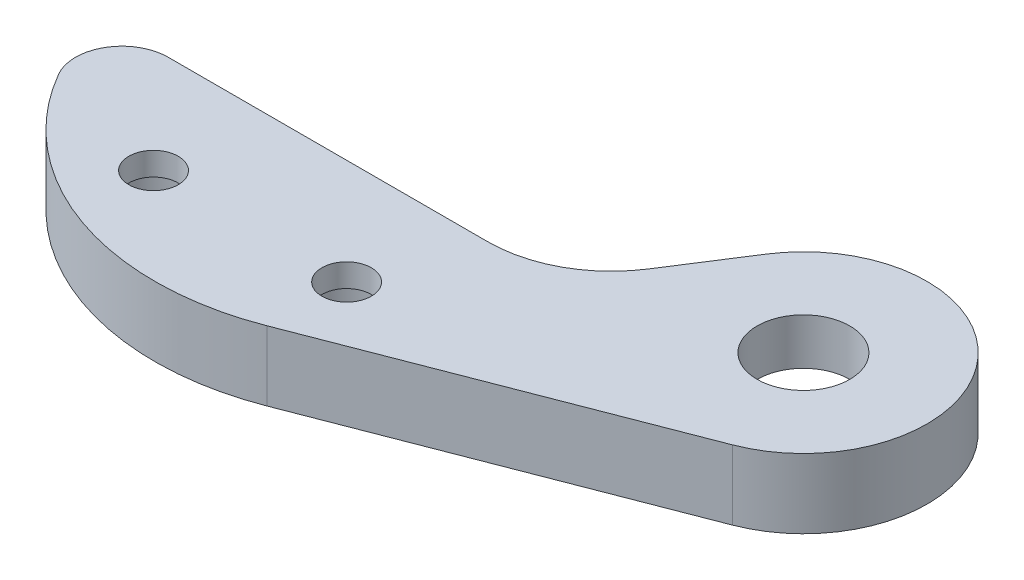
ISO-10303-21;
HEADER;
FILE_DESCRIPTION(('STEP AP214'),'2;1');
FILE_NAME('part.step','',(''),(''),'','','');
FILE_SCHEMA(('AUTOMOTIVE_DESIGN { 1 0 10303 214 1 1 1 1 }'));
ENDSEC;
DATA;
#1=APPLICATION_CONTEXT('core data for automotive mechanical design processes');
#2=APPLICATION_PROTOCOL_DEFINITION('international standard','automotive_design',2000,#1);
#3=PRODUCT_CONTEXT('',#1,'mechanical');
#4=PRODUCT('Part','Part','',(#3));
#5=PRODUCT_RELATED_PRODUCT_CATEGORY('part','',(#4));
#6=PRODUCT_DEFINITION_FORMATION('','',#4);
#7=PRODUCT_DEFINITION_CONTEXT('part definition',#1,'design');
#8=PRODUCT_DEFINITION('design','',#6,#7);
#9=PRODUCT_DEFINITION_SHAPE('','',#8);
#10=(LENGTH_UNIT() NAMED_UNIT(*) SI_UNIT(.MILLI.,.METRE.));
#11=(NAMED_UNIT(*) PLANE_ANGLE_UNIT() SI_UNIT($,.RADIAN.));
#12=(NAMED_UNIT(*) SI_UNIT($,.STERADIAN.) SOLID_ANGLE_UNIT());
#13=UNCERTAINTY_MEASURE_WITH_UNIT(LENGTH_MEASURE(1.E-05),#10,'distance_accuracy_value','');
#14=(GEOMETRIC_REPRESENTATION_CONTEXT(3) GLOBAL_UNCERTAINTY_ASSIGNED_CONTEXT((#13)) GLOBAL_UNIT_ASSIGNED_CONTEXT((#10,
#11,#12)) REPRESENTATION_CONTEXT('',''));
#15=CARTESIAN_POINT('',(0.,0.,0.));
#16=DIRECTION('',(0.,0.,1.));
#17=DIRECTION('',(1.,0.,0.));
#18=AXIS2_PLACEMENT_3D('',#15,#16,#17);
#19=CARTESIAN_POINT('',(0.,-4.5,0.));
#20=DIRECTION('',(0.,1.,0.));
#21=DIRECTION('',(0.,0.,-1.));
#22=AXIS2_PLACEMENT_3D('',#19,#20,#21);
#23=CYLINDRICAL_SURFACE('',#22,17.);
#24=CARTESIAN_POINT('',(0.,0.,0.));
#25=DIRECTION('',(0.,-1.,0.));
#26=DIRECTION('',(0.,0.,-1.));
#27=AXIS2_PLACEMENT_3D('',#24,#25,#26);
#28=CIRCLE('',#27,17.);
#29=CARTESIAN_POINT('',(6.12,0.,15.8601891539792));
#30=VERTEX_POINT('',#29);
#31=CARTESIAN_POINT('',(-14.7224318643355,0.,8.5));
#32=VERTEX_POINT('',#31);
#33=EDGE_CURVE('E116',#30,#32,#28,.T.);
#34=ORIENTED_EDGE('',*,*,#33,.T.);
#35=DIRECTION('',(0.,1.,0.));
#36=VECTOR('',#35,1.);
#37=CARTESIAN_POINT('',(-14.7224318643355,-4.5,8.5));
#38=LINE('',#37,#36);
#39=CARTESIAN_POINT('',(-14.7224318643355,-4.5,8.5));
#40=VERTEX_POINT('',#39);
#41=EDGE_CURVE('E98',#40,#32,#38,.T.);
#42=ORIENTED_EDGE('',*,*,#41,.F.);
#43=CARTESIAN_POINT('',(0.,-4.5,0.));
#44=DIRECTION('',(0.,-1.,0.));
#45=DIRECTION('',(0.,0.,-1.));
#46=AXIS2_PLACEMENT_3D('',#43,#44,#45);
#47=CIRCLE('',#46,17.);
#48=CARTESIAN_POINT('',(6.12,-4.5,15.8601891539792));
#49=VERTEX_POINT('',#48);
#50=EDGE_CURVE('E104',#49,#40,#47,.T.);
#51=ORIENTED_EDGE('',*,*,#50,.F.);
#52=DIRECTION('',(0.,1.,0.));
#53=VECTOR('',#52,1.);
#54=CARTESIAN_POINT('',(6.12,-4.5,15.8601891539792));
#55=LINE('',#54,#53);
#56=EDGE_CURVE('E127',#49,#30,#55,.T.);
#57=ORIENTED_EDGE('',*,*,#56,.T.);
#58=EDGE_LOOP('',(#34,#42,#51,#57));
#59=FACE_BOUND('',#58,.T.);
#60=ADVANCED_FACE('F38',(#59),#23,.T.);
#61=CARTESIAN_POINT('',(27.88,-4.5,7.46361842540199));
#62=DIRECTION('',(0.359999999999999,0.,0.932952303175248));
#63=DIRECTION('',(0.932952303175248,0.,-0.359999999999999));
#64=AXIS2_PLACEMENT_3D('',#61,#62,#63);
#65=PLANE('',#64);
#66=DIRECTION('',(-0.932952303175248,0.,0.359999999999999));
#67=VECTOR('',#66,1.);
#68=CARTESIAN_POINT('',(27.88,0.,7.46361842540199));
#69=LINE('',#68,#67);
#70=CARTESIAN_POINT('',(27.88,0.,7.46361842540199));
#71=VERTEX_POINT('',#70);
#72=EDGE_CURVE('E113',#71,#30,#69,.T.);
#73=ORIENTED_EDGE('',*,*,#72,.T.);
#74=ORIENTED_EDGE('',*,*,#56,.F.);
#75=DIRECTION('',(-0.932952303175248,0.,0.359999999999999));
#76=VECTOR('',#75,1.);
#77=CARTESIAN_POINT('',(27.88,-4.5,7.46361842540199));
#78=LINE('',#77,#76);
#79=CARTESIAN_POINT('',(27.88,-4.5,7.46361842540199));
#80=VERTEX_POINT('',#79);
#81=EDGE_CURVE('E109',#80,#49,#78,.T.);
#82=ORIENTED_EDGE('',*,*,#81,.F.);
#83=DIRECTION('',(0.,1.,0.));
#84=VECTOR('',#83,1.);
#85=CARTESIAN_POINT('',(27.88,-4.5,7.46361842540199));
#86=LINE('',#85,#84);
#87=EDGE_CURVE('E154',#80,#71,#86,.T.);
#88=ORIENTED_EDGE('',*,*,#87,.T.);
#89=EDGE_LOOP('',(#73,#74,#82,#88));
#90=FACE_BOUND('',#89,.T.);
#91=ADVANCED_FACE('F164',(#90),#65,.T.);
#92=CARTESIAN_POINT('',(25.,-4.5,0.));
#93=DIRECTION('',(0.,1.,0.));
#94=DIRECTION('',(0.,0.,-1.));
#95=AXIS2_PLACEMENT_3D('',#92,#93,#94);
#96=CYLINDRICAL_SURFACE('',#95,8.00000000000001);
#97=CARTESIAN_POINT('',(25.,0.,0.));
#98=DIRECTION('',(0.,-1.,0.));
#99=DIRECTION('',(0.,0.,-1.));
#100=AXIS2_PLACEMENT_3D('',#97,#98,#99);
#101=CIRCLE('',#100,8.00000000000001);
#102=CARTESIAN_POINT('',(18.2638318794235,0.,-4.31555779144817));
#103=VERTEX_POINT('',#102);
#104=EDGE_CURVE('E150',#103,#71,#101,.T.);
#105=ORIENTED_EDGE('',*,*,#104,.T.);
#106=ORIENTED_EDGE('',*,*,#87,.F.);
#107=CARTESIAN_POINT('',(25.,-4.5,0.));
#108=DIRECTION('',(0.,-1.,0.));
#109=DIRECTION('',(0.,0.,-1.));
#110=AXIS2_PLACEMENT_3D('',#107,#108,#109);
#111=CIRCLE('',#110,8.00000000000001);
#112=CARTESIAN_POINT('',(18.2638318794235,-4.5,-4.31555779144817));
#113=VERTEX_POINT('',#112);
#114=EDGE_CURVE('E120',#113,#80,#111,.T.);
#115=ORIENTED_EDGE('',*,*,#114,.F.);
#116=DIRECTION('',(0.,1.,0.));
#117=VECTOR('',#116,1.);
#118=CARTESIAN_POINT('',(18.2638318794235,-4.5,-4.31555779144817));
#119=LINE('',#118,#117);
#120=EDGE_CURVE('E118',#113,#103,#119,.T.);
#121=ORIENTED_EDGE('',*,*,#120,.T.);
#122=EDGE_LOOP('',(#105,#106,#115,#121));
#123=FACE_BOUND('',#122,.T.);
#124=ADVANCED_FACE('F158',(#123),#96,.T.);
#125=CARTESIAN_POINT('',(12.9364306663359,-4.5,4.));
#126=DIRECTION('',(-0.842021015072063,0.,-0.539444723931019));
#127=DIRECTION('',(-0.539444723931019,0.,0.842021015072063));
#128=AXIS2_PLACEMENT_3D('',#125,#126,#127);
#129=PLANE('',#128);
#130=DIRECTION('',(0.539444723931019,0.,-0.842021015072062));
#131=VECTOR('',#130,1.);
#132=CARTESIAN_POINT('',(12.9364306663359,0.,4.));
#133=LINE('',#132,#131);
#134=CARTESIAN_POINT('',(15.2968858978029,0.,0.315557791448156));
#135=VERTEX_POINT('',#134);
#136=EDGE_CURVE('E148',#135,#103,#133,.T.);
#137=ORIENTED_EDGE('',*,*,#136,.T.);
#138=ORIENTED_EDGE('',*,*,#120,.F.);
#139=DIRECTION('',(0.539444723931019,0.,-0.842021015072062));
#140=VECTOR('',#139,1.);
#141=CARTESIAN_POINT('',(12.9364306663359,-4.5,4.));
#142=LINE('',#141,#140);
#143=CARTESIAN_POINT('',(15.2968858978029,-4.5,0.315557791448156));
#144=VERTEX_POINT('',#143);
#145=EDGE_CURVE('E133',#144,#113,#142,.T.);
#146=ORIENTED_EDGE('',*,*,#145,.F.);
#147=DIRECTION('',(0.,1.,0.));
#148=VECTOR('',#147,1.);
#149=CARTESIAN_POINT('',(15.2968858978029,-4.5,0.315557791448155));
#150=LINE('',#149,#148);
#151=EDGE_CURVE('E126',#135,#144,#150,.F.);
#152=ORIENTED_EDGE('',*,*,#151,.F.);
#153=EDGE_LOOP('',(#137,#138,#146,#152));
#154=FACE_BOUND('',#153,.T.);
#155=ADVANCED_FACE('F134',(#154),#129,.T.);
#156=CARTESIAN_POINT('',(-12.1243556529821,-4.5,4.));
#157=DIRECTION('',(0.,0.,-1.));
#158=DIRECTION('',(-1.,0.,0.));
#159=AXIS2_PLACEMENT_3D('',#156,#157,#158);
#160=PLANE('',#159);
#161=DIRECTION('',(1.,0.,0.));
#162=VECTOR('',#161,1.);
#163=CARTESIAN_POINT('',(-12.1243556529821,-4.5,4.));
#164=LINE('',#163,#162);
#165=CARTESIAN_POINT('',(-12.1243556529821,-4.5,4.));
#166=VERTEX_POINT('',#165);
#167=CARTESIAN_POINT('',(8.56071777722641,-4.5,4.));
#168=VERTEX_POINT('',#167);
#169=EDGE_CURVE('E103',#166,#168,#164,.T.);
#170=ORIENTED_EDGE('',*,*,#169,.F.);
#171=DIRECTION('',(0.,1.,0.));
#172=VECTOR('',#171,1.);
#173=CARTESIAN_POINT('',(-12.1243556529821,-4.5,4.));
#174=LINE('',#173,#172);
#175=CARTESIAN_POINT('',(-12.1243556529821,0.,4.));
#176=VERTEX_POINT('',#175);
#177=EDGE_CURVE('E101',#166,#176,#174,.T.);
#178=ORIENTED_EDGE('',*,*,#177,.T.);
#179=DIRECTION('',(1.,0.,0.));
#180=VECTOR('',#179,1.);
#181=CARTESIAN_POINT('',(-12.1243556529821,0.,4.));
#182=LINE('',#181,#180);
#183=CARTESIAN_POINT('',(8.56071777722641,0.,4.));
#184=VERTEX_POINT('',#183);
#185=EDGE_CURVE('E145',#176,#184,#182,.T.);
#186=ORIENTED_EDGE('',*,*,#185,.T.);
#187=DIRECTION('',(0.,1.,0.));
#188=VECTOR('',#187,1.);
#189=CARTESIAN_POINT('',(8.56071777722641,0.,4.));
#190=LINE('',#189,#188);
#191=EDGE_CURVE('E124',#168,#184,#190,.T.);
#192=ORIENTED_EDGE('',*,*,#191,.F.);
#193=EDGE_LOOP('',(#170,#178,#186,#192));
#194=FACE_BOUND('',#193,.T.);
#195=ADVANCED_FACE('F177',(#194),#160,.T.);
#196=CARTESIAN_POINT('',(-12.1243556529821,-4.5,7.));
#197=DIRECTION('',(0.,1.,0.));
#198=DIRECTION('',(0.,0.,-1.));
#199=AXIS2_PLACEMENT_3D('',#196,#197,#198);
#200=CYLINDRICAL_SURFACE('',#199,3.);
#201=CARTESIAN_POINT('',(-12.1243556529821,0.,7.));
#202=DIRECTION('',(0.,-1.,0.));
#203=DIRECTION('',(0.,0.,-1.));
#204=AXIS2_PLACEMENT_3D('',#201,#202,#203);
#205=CIRCLE('',#204,3.);
#206=EDGE_CURVE('E142',#32,#176,#205,.T.);
#207=ORIENTED_EDGE('',*,*,#206,.T.);
#208=ORIENTED_EDGE('',*,*,#177,.F.);
#209=CARTESIAN_POINT('',(-12.1243556529821,-4.5,7.));
#210=DIRECTION('',(0.,-1.,0.));
#211=DIRECTION('',(0.,0.,-1.));
#212=AXIS2_PLACEMENT_3D('',#209,#210,#211);
#213=CIRCLE('',#212,3.);
#214=EDGE_CURVE('E94',#40,#166,#213,.T.);
#215=ORIENTED_EDGE('',*,*,#214,.F.);
#216=ORIENTED_EDGE('',*,*,#41,.T.);
#217=EDGE_LOOP('',(#207,#208,#215,#216));
#218=FACE_BOUND('',#217,.T.);
#219=ADVANCED_FACE('F96',(#218),#200,.T.);
#220=CARTESIAN_POINT('',(0.,-4.5,0.));
#221=DIRECTION('',(0.,1.,0.));
#222=DIRECTION('',(0.,0.,-1.));
#223=AXIS2_PLACEMENT_3D('',#220,#221,#222);
#224=PLANE('',#223);
#225=CARTESIAN_POINT('',(25.,-4.5,0.));
#226=DIRECTION('',(0.,1.,0.));
#227=DIRECTION('',(0.,0.,1.));
#228=AXIS2_PLACEMENT_3D('',#225,#226,#227);
#229=CIRCLE('',#228,5.25000000000001);
#230=CARTESIAN_POINT('',(25.,-4.5,5.25000000000001));
#231=VERTEX_POINT('',#230);
#232=EDGE_CURVE('E236',#231,#231,#229,.T.);
#233=ORIENTED_EDGE('',*,*,#232,.T.);
#234=EDGE_LOOP('',(#233));
#235=FACE_BOUND('',#234,.T.);
#236=CARTESIAN_POINT('',(-6.25,-4.5,10.8253175473055));
#237=DIRECTION('',(0.,1.,0.));
#238=DIRECTION('',(0.,0.,1.));
#239=AXIS2_PLACEMENT_3D('',#236,#237,#238);
#240=CIRCLE('',#239,3.025);
#241=CARTESIAN_POINT('',(-6.25,-4.5,13.8503175473055));
#242=VERTEX_POINT('',#241);
#243=EDGE_CURVE('E246',#242,#242,#240,.T.);
#244=ORIENTED_EDGE('',*,*,#243,.T.);
#245=EDGE_LOOP('',(#244));
#246=FACE_BOUND('',#245,.T.);
#247=CARTESIAN_POINT('',(6.25,-4.5,10.8253175473055));
#248=DIRECTION('',(0.,1.,0.));
#249=DIRECTION('',(0.,0.,1.));
#250=AXIS2_PLACEMENT_3D('',#247,#248,#249);
#251=CIRCLE('',#250,3.025);
#252=CARTESIAN_POINT('',(6.25,-4.5,13.8503175473055));
#253=VERTEX_POINT('',#252);
#254=EDGE_CURVE('E258',#253,#253,#251,.T.);
#255=ORIENTED_EDGE('',*,*,#254,.T.);
#256=EDGE_LOOP('',(#255));
#257=FACE_BOUND('',#256,.T.);
#258=ORIENTED_EDGE('',*,*,#50,.T.);
#259=ORIENTED_EDGE('',*,*,#214,.T.);
#260=ORIENTED_EDGE('',*,*,#169,.T.);
#261=CARTESIAN_POINT('',(8.56071777722641,-4.5,-4.));
#262=DIRECTION('',(0.,-1.,0.));
#263=DIRECTION('',(0.,0.,-1.));
#264=AXIS2_PLACEMENT_3D('',#261,#262,#263);
#265=CIRCLE('',#264,8.);
#266=EDGE_CURVE('E11',#144,#168,#265,.T.);
#267=ORIENTED_EDGE('',*,*,#266,.F.);
#268=ORIENTED_EDGE('',*,*,#145,.T.);
#269=ORIENTED_EDGE('',*,*,#114,.T.);
#270=ORIENTED_EDGE('',*,*,#81,.T.);
#271=EDGE_LOOP('',(#258,#259,#260,#267,#268,#269,#270));
#272=FACE_BOUND('',#271,.T.);
#273=ADVANCED_FACE('F107',(#235,#246,#257,#272),#224,.F.);
#274=CARTESIAN_POINT('',(0.,0.,0.));
#275=DIRECTION('',(0.,1.,0.));
#276=DIRECTION('',(0.,0.,-1.));
#277=AXIS2_PLACEMENT_3D('',#274,#275,#276);
#278=PLANE('',#277);
#279=CARTESIAN_POINT('',(25.,0.,0.));
#280=DIRECTION('',(0.,1.,0.));
#281=DIRECTION('',(0.,0.,1.));
#282=AXIS2_PLACEMENT_3D('',#279,#280,#281);
#283=CIRCLE('',#282,3.00000000000001);
#284=CARTESIAN_POINT('',(25.,0.,3.00000000000001));
#285=VERTEX_POINT('',#284);
#286=EDGE_CURVE('E243',#285,#285,#283,.T.);
#287=ORIENTED_EDGE('',*,*,#286,.F.);
#288=EDGE_LOOP('',(#287));
#289=FACE_BOUND('',#288,.T.);
#290=CARTESIAN_POINT('',(-6.25,0.,10.8253175473055));
#291=DIRECTION('',(0.,1.,0.));
#292=DIRECTION('',(0.,0.,1.));
#293=AXIS2_PLACEMENT_3D('',#290,#291,#292);
#294=CIRCLE('',#293,1.60000000000001);
#295=CARTESIAN_POINT('',(-6.25,0.,12.4253175473055));
#296=VERTEX_POINT('',#295);
#297=EDGE_CURVE('E255',#296,#296,#294,.T.);
#298=ORIENTED_EDGE('',*,*,#297,.F.);
#299=EDGE_LOOP('',(#298));
#300=FACE_BOUND('',#299,.T.);
#301=CARTESIAN_POINT('',(6.25,0.,10.8253175473055));
#302=DIRECTION('',(0.,1.,0.));
#303=DIRECTION('',(0.,0.,1.));
#304=AXIS2_PLACEMENT_3D('',#301,#302,#303);
#305=CIRCLE('',#304,1.60000000000001);
#306=CARTESIAN_POINT('',(6.25,0.,12.4253175473055));
#307=VERTEX_POINT('',#306);
#308=EDGE_CURVE('E143',#307,#307,#305,.T.);
#309=ORIENTED_EDGE('',*,*,#308,.F.);
#310=EDGE_LOOP('',(#309));
#311=FACE_BOUND('',#310,.T.);
#312=ORIENTED_EDGE('',*,*,#33,.F.);
#313=ORIENTED_EDGE('',*,*,#72,.F.);
#314=ORIENTED_EDGE('',*,*,#104,.F.);
#315=ORIENTED_EDGE('',*,*,#136,.F.);
#316=CARTESIAN_POINT('',(8.56071777722641,0.,-4.));
#317=DIRECTION('',(0.,-1.,0.));
#318=DIRECTION('',(0.,0.,-1.));
#319=AXIS2_PLACEMENT_3D('',#316,#317,#318);
#320=CIRCLE('',#319,8.);
#321=EDGE_CURVE('E46',#184,#135,#320,.F.);
#322=ORIENTED_EDGE('',*,*,#321,.F.);
#323=ORIENTED_EDGE('',*,*,#185,.F.);
#324=ORIENTED_EDGE('',*,*,#206,.F.);
#325=EDGE_LOOP('',(#312,#313,#314,#315,#322,#323,#324));
#326=FACE_BOUND('',#325,.T.);
#327=ADVANCED_FACE('F162',(#289,#300,#311,#326),#278,.T.);
#328=CARTESIAN_POINT('',(6.25,-4.5,10.8253175473055));
#329=DIRECTION('',(0.,-1.,0.));
#330=DIRECTION('',(0.,0.,1.));
#331=AXIS2_PLACEMENT_3D('',#328,#329,#330);
#332=CYLINDRICAL_SURFACE('',#331,1.60000000000001);
#333=ORIENTED_EDGE('',*,*,#308,.T.);
#334=EDGE_LOOP('',(#333));
#335=FACE_BOUND('',#334,.T.);
#336=CARTESIAN_POINT('',(6.25,-1.5,10.8253175473055));
#337=DIRECTION('',(0.,1.,0.));
#338=DIRECTION('',(0.,0.,1.));
#339=AXIS2_PLACEMENT_3D('',#336,#337,#338);
#340=CIRCLE('',#339,1.60000000000001);
#341=CARTESIAN_POINT('',(6.25,-1.5,12.4253175473055));
#342=VERTEX_POINT('',#341);
#343=EDGE_CURVE('E264',#342,#342,#340,.T.);
#344=ORIENTED_EDGE('',*,*,#343,.F.);
#345=EDGE_LOOP('',(#344));
#346=FACE_BOUND('',#345,.T.);
#347=ADVANCED_FACE('F189',(#335,#346),#332,.F.);
#348=CARTESIAN_POINT('',(7.85000000000001,-1.5,10.8253175473055));
#349=DIRECTION('',(0.,1.,0.));
#350=DIRECTION('',(0.,0.,-1.));
#351=AXIS2_PLACEMENT_3D('',#348,#349,#350);
#352=PLANE('',#351);
#353=ORIENTED_EDGE('',*,*,#343,.T.);
#354=EDGE_LOOP('',(#353));
#355=FACE_BOUND('',#354,.T.);
#356=CARTESIAN_POINT('',(6.25,-1.5,10.8253175473055));
#357=DIRECTION('',(0.,1.,0.));
#358=DIRECTION('',(0.,0.,1.));
#359=AXIS2_PLACEMENT_3D('',#356,#357,#358);
#360=CIRCLE('',#359,3.025);
#361=CARTESIAN_POINT('',(6.25,-1.5,13.8503175473055));
#362=VERTEX_POINT('',#361);
#363=EDGE_CURVE('E261',#362,#362,#360,.T.);
#364=ORIENTED_EDGE('',*,*,#363,.F.);
#365=EDGE_LOOP('',(#364));
#366=FACE_BOUND('',#365,.T.);
#367=ADVANCED_FACE('F196',(#355,#366),#352,.F.);
#368=CARTESIAN_POINT('',(6.25,-4.5,10.8253175473055));
#369=DIRECTION('',(0.,-1.,0.));
#370=DIRECTION('',(0.,0.,1.));
#371=AXIS2_PLACEMENT_3D('',#368,#369,#370);
#372=CYLINDRICAL_SURFACE('',#371,3.025);
#373=ORIENTED_EDGE('',*,*,#363,.T.);
#374=EDGE_LOOP('',(#373));
#375=FACE_BOUND('',#374,.T.);
#376=ORIENTED_EDGE('',*,*,#254,.F.);
#377=EDGE_LOOP('',(#376));
#378=FACE_BOUND('',#377,.T.);
#379=ADVANCED_FACE('F200',(#375,#378),#372,.F.);
#380=CARTESIAN_POINT('',(-6.25,-4.5,10.8253175473055));
#381=DIRECTION('',(0.,-1.,0.));
#382=DIRECTION('',(0.,0.,1.));
#383=AXIS2_PLACEMENT_3D('',#380,#381,#382);
#384=CYLINDRICAL_SURFACE('',#383,1.60000000000001);
#385=ORIENTED_EDGE('',*,*,#297,.T.);
#386=EDGE_LOOP('',(#385));
#387=FACE_BOUND('',#386,.T.);
#388=CARTESIAN_POINT('',(-6.25,-1.5,10.8253175473055));
#389=DIRECTION('',(0.,1.,0.));
#390=DIRECTION('',(0.,0.,1.));
#391=AXIS2_PLACEMENT_3D('',#388,#389,#390);
#392=CIRCLE('',#391,1.60000000000001);
#393=CARTESIAN_POINT('',(-6.25,-1.5,12.4253175473055));
#394=VERTEX_POINT('',#393);
#395=EDGE_CURVE('E252',#394,#394,#392,.T.);
#396=ORIENTED_EDGE('',*,*,#395,.F.);
#397=EDGE_LOOP('',(#396));
#398=FACE_BOUND('',#397,.T.);
#399=ADVANCED_FACE('F204',(#387,#398),#384,.F.);
#400=CARTESIAN_POINT('',(-4.64999999999999,-1.5,10.8253175473055));
#401=DIRECTION('',(0.,1.,0.));
#402=DIRECTION('',(0.,0.,-1.));
#403=AXIS2_PLACEMENT_3D('',#400,#401,#402);
#404=PLANE('',#403);
#405=ORIENTED_EDGE('',*,*,#395,.T.);
#406=EDGE_LOOP('',(#405));
#407=FACE_BOUND('',#406,.T.);
#408=CARTESIAN_POINT('',(-6.25,-1.5,10.8253175473055));
#409=DIRECTION('',(0.,1.,0.));
#410=DIRECTION('',(0.,0.,1.));
#411=AXIS2_PLACEMENT_3D('',#408,#409,#410);
#412=CIRCLE('',#411,3.025);
#413=CARTESIAN_POINT('',(-6.25,-1.5,13.8503175473055));
#414=VERTEX_POINT('',#413);
#415=EDGE_CURVE('E249',#414,#414,#412,.T.);
#416=ORIENTED_EDGE('',*,*,#415,.F.);
#417=EDGE_LOOP('',(#416));
#418=FACE_BOUND('',#417,.T.);
#419=ADVANCED_FACE('F208',(#407,#418),#404,.F.);
#420=CARTESIAN_POINT('',(-6.25,-4.5,10.8253175473055));
#421=DIRECTION('',(0.,-1.,0.));
#422=DIRECTION('',(0.,0.,1.));
#423=AXIS2_PLACEMENT_3D('',#420,#421,#422);
#424=CYLINDRICAL_SURFACE('',#423,3.025);
#425=ORIENTED_EDGE('',*,*,#415,.T.);
#426=EDGE_LOOP('',(#425));
#427=FACE_BOUND('',#426,.T.);
#428=ORIENTED_EDGE('',*,*,#243,.F.);
#429=EDGE_LOOP('',(#428));
#430=FACE_BOUND('',#429,.T.);
#431=ADVANCED_FACE('F212',(#427,#430),#424,.F.);
#432=CARTESIAN_POINT('',(25.,-4.5,0.));
#433=DIRECTION('',(0.,-1.,0.));
#434=DIRECTION('',(0.,0.,1.));
#435=AXIS2_PLACEMENT_3D('',#432,#433,#434);
#436=CYLINDRICAL_SURFACE('',#435,3.00000000000001);
#437=ORIENTED_EDGE('',*,*,#286,.T.);
#438=EDGE_LOOP('',(#437));
#439=FACE_BOUND('',#438,.T.);
#440=CARTESIAN_POINT('',(25.,-3.,0.));
#441=DIRECTION('',(0.,1.,0.));
#442=DIRECTION('',(0.,0.,1.));
#443=AXIS2_PLACEMENT_3D('',#440,#441,#442);
#444=CIRCLE('',#443,3.00000000000001);
#445=CARTESIAN_POINT('',(25.,-3.,3.00000000000001));
#446=VERTEX_POINT('',#445);
#447=EDGE_CURVE('E238',#446,#446,#444,.T.);
#448=ORIENTED_EDGE('',*,*,#447,.F.);
#449=EDGE_LOOP('',(#448));
#450=FACE_BOUND('',#449,.T.);
#451=ADVANCED_FACE('F216',(#439,#450),#436,.F.);
#452=CARTESIAN_POINT('',(28.,-3.,0.));
#453=DIRECTION('',(0.,1.,0.));
#454=DIRECTION('',(0.,0.,-1.));
#455=AXIS2_PLACEMENT_3D('',#452,#453,#454);
#456=PLANE('',#455);
#457=ORIENTED_EDGE('',*,*,#447,.T.);
#458=EDGE_LOOP('',(#457));
#459=FACE_BOUND('',#458,.T.);
#460=CARTESIAN_POINT('',(25.,-3.,0.));
#461=DIRECTION('',(0.,1.,0.));
#462=DIRECTION('',(0.,0.,1.));
#463=AXIS2_PLACEMENT_3D('',#460,#461,#462);
#464=CIRCLE('',#463,5.25000000000001);
#465=CARTESIAN_POINT('',(25.,-3.,5.25000000000001));
#466=VERTEX_POINT('',#465);
#467=EDGE_CURVE('E234',#466,#466,#464,.T.);
#468=ORIENTED_EDGE('',*,*,#467,.F.);
#469=EDGE_LOOP('',(#468));
#470=FACE_BOUND('',#469,.T.);
#471=ADVANCED_FACE('F220',(#459,#470),#456,.F.);
#472=CARTESIAN_POINT('',(25.,-4.5,0.));
#473=DIRECTION('',(0.,-1.,0.));
#474=DIRECTION('',(0.,0.,1.));
#475=AXIS2_PLACEMENT_3D('',#472,#473,#474);
#476=CYLINDRICAL_SURFACE('',#475,5.25000000000001);
#477=ORIENTED_EDGE('',*,*,#467,.T.);
#478=EDGE_LOOP('',(#477));
#479=FACE_BOUND('',#478,.T.);
#480=ORIENTED_EDGE('',*,*,#232,.F.);
#481=EDGE_LOOP('',(#480));
#482=FACE_BOUND('',#481,.T.);
#483=ADVANCED_FACE('F224',(#479,#482),#476,.F.);
#484=CARTESIAN_POINT('',(8.56071777722641,-4.5,-4.));
#485=DIRECTION('',(0.,-1.,0.));
#486=DIRECTION('',(0.,0.,1.));
#487=AXIS2_PLACEMENT_3D('',#484,#485,#486);
#488=CYLINDRICAL_SURFACE('',#487,8.);
#489=ORIENTED_EDGE('',*,*,#266,.T.);
#490=ORIENTED_EDGE('',*,*,#191,.T.);
#491=ORIENTED_EDGE('',*,*,#321,.T.);
#492=ORIENTED_EDGE('',*,*,#151,.T.);
#493=EDGE_LOOP('',(#489,#490,#491,#492));
#494=FACE_BOUND('',#493,.T.);
#495=ADVANCED_FACE('F40',(#494),#488,.F.);
#496=CLOSED_SHELL('',(#60,#91,#124,#155,#195,#219,#273,#327,#347,#367,#379,#399,#419,#431,#451,
#471,#483,#495));
#497=MANIFOLD_SOLID_BREP('B2',#496);
#498=ADVANCED_BREP_SHAPE_REPRESENTATION('',(#18,#497),#14);
#499=SHAPE_DEFINITION_REPRESENTATION(#9,#498);
ENDSEC;
END-ISO-10303-21;
